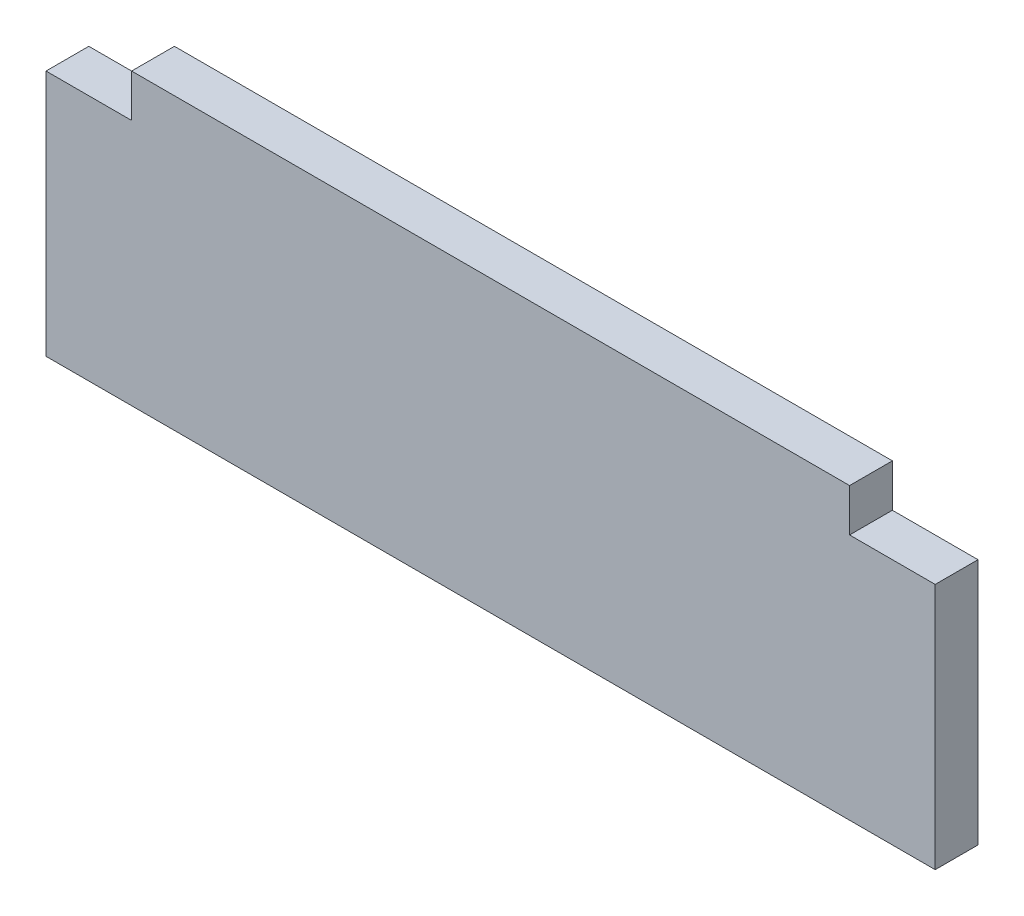
ISO-10303-21;
HEADER;
FILE_DESCRIPTION(('STEP AP214'),'2;1');
FILE_NAME('part.step','',(''),(''),'','','');
FILE_SCHEMA(('AUTOMOTIVE_DESIGN { 1 0 10303 214 1 1 1 1 }'));
ENDSEC;
DATA;
#1=APPLICATION_CONTEXT('core data for automotive mechanical design processes');
#2=APPLICATION_PROTOCOL_DEFINITION('international standard','automotive_design',2000,#1);
#3=PRODUCT_CONTEXT('',#1,'mechanical');
#4=PRODUCT('Part','Part','',(#3));
#5=PRODUCT_RELATED_PRODUCT_CATEGORY('part','',(#4));
#6=PRODUCT_DEFINITION_FORMATION('','',#4);
#7=PRODUCT_DEFINITION_CONTEXT('part definition',#1,'design');
#8=PRODUCT_DEFINITION('design','',#6,#7);
#9=PRODUCT_DEFINITION_SHAPE('','',#8);
#10=(LENGTH_UNIT() NAMED_UNIT(*) SI_UNIT(.MILLI.,.METRE.));
#11=(NAMED_UNIT(*) PLANE_ANGLE_UNIT() SI_UNIT($,.RADIAN.));
#12=(NAMED_UNIT(*) SI_UNIT($,.STERADIAN.) SOLID_ANGLE_UNIT());
#13=UNCERTAINTY_MEASURE_WITH_UNIT(LENGTH_MEASURE(1.E-05),#10,'distance_accuracy_value','');
#14=(GEOMETRIC_REPRESENTATION_CONTEXT(3) GLOBAL_UNCERTAINTY_ASSIGNED_CONTEXT((#13)) GLOBAL_UNIT_ASSIGNED_CONTEXT((#10,
#11,#12)) REPRESENTATION_CONTEXT('',''));
#15=CARTESIAN_POINT('',(0.,0.,0.));
#16=DIRECTION('',(0.,0.,1.));
#17=DIRECTION('',(1.,0.,0.));
#18=AXIS2_PLACEMENT_3D('',#15,#16,#17);
#19=CARTESIAN_POINT('',(65.950000053,21.500000053,3.175));
#20=DIRECTION('',(-1.,0.,0.));
#21=DIRECTION('',(0.,0.,1.));
#22=AXIS2_PLACEMENT_3D('',#19,#20,#21);
#23=PLANE('',#22);
#24=DIRECTION('',(0.,0.,1.));
#25=VECTOR('',#24,1.);
#26=CARTESIAN_POINT('',(65.950000053,15.150000053,-3.175));
#27=LINE('',#26,#25);
#28=CARTESIAN_POINT('',(65.950000053,15.150000053,-3.175));
#29=VERTEX_POINT('',#28);
#30=CARTESIAN_POINT('',(65.950000053,15.150000053,3.175));
#31=VERTEX_POINT('',#30);
#32=EDGE_CURVE('E159',#29,#31,#27,.T.);
#33=ORIENTED_EDGE('',*,*,#32,.T.);
#34=DIRECTION('',(0.,1.,0.));
#35=VECTOR('',#34,1.);
#36=CARTESIAN_POINT('',(65.950000053,21.500000053,3.175));
#37=LINE('',#36,#35);
#38=CARTESIAN_POINT('',(65.950000053,-21.500000053,3.175));
#39=VERTEX_POINT('',#38);
#40=EDGE_CURVE('E132',#39,#31,#37,.T.);
#41=ORIENTED_EDGE('',*,*,#40,.F.);
#42=DIRECTION('',(0.,0.,-1.));
#43=VECTOR('',#42,1.);
#44=CARTESIAN_POINT('',(65.950000053,-21.500000053,3.175));
#45=LINE('',#44,#43);
#46=CARTESIAN_POINT('',(65.950000053,-21.500000053,-3.175));
#47=VERTEX_POINT('',#46);
#48=EDGE_CURVE('E46',#39,#47,#45,.T.);
#49=ORIENTED_EDGE('',*,*,#48,.T.);
#50=DIRECTION('',(0.,1.,0.));
#51=VECTOR('',#50,1.);
#52=CARTESIAN_POINT('',(65.950000053,21.500000053,-3.175));
#53=LINE('',#52,#51);
#54=EDGE_CURVE('E123',#47,#29,#53,.T.);
#55=ORIENTED_EDGE('',*,*,#54,.T.);
#56=EDGE_LOOP('',(#33,#41,#49,#55));
#57=FACE_BOUND('',#56,.T.);
#58=ADVANCED_FACE('F39',(#57),#23,.F.);
#59=CARTESIAN_POINT('',(-65.950000053,21.500000053,3.175));
#60=DIRECTION('',(0.,-1.,0.));
#61=DIRECTION('',(0.,0.,-1.));
#62=AXIS2_PLACEMENT_3D('',#59,#60,#61);
#63=PLANE('',#62);
#64=DIRECTION('',(0.,0.,1.));
#65=VECTOR('',#64,1.);
#66=CARTESIAN_POINT('',(53.250000053,21.500000053,-3.175));
#67=LINE('',#66,#65);
#68=CARTESIAN_POINT('',(53.250000053,21.500000053,-3.175));
#69=VERTEX_POINT('',#68);
#70=CARTESIAN_POINT('',(53.250000053,21.500000053,3.175));
#71=VERTEX_POINT('',#70);
#72=EDGE_CURVE('E105',#69,#71,#67,.T.);
#73=ORIENTED_EDGE('',*,*,#72,.F.);
#74=DIRECTION('',(-1.,0.,0.));
#75=VECTOR('',#74,1.);
#76=CARTESIAN_POINT('',(-65.950000053,21.500000053,-3.175));
#77=LINE('',#76,#75);
#78=CARTESIAN_POINT('',(-53.250000053,21.500000053,-3.175));
#79=VERTEX_POINT('',#78);
#80=EDGE_CURVE('E117',#69,#79,#77,.T.);
#81=ORIENTED_EDGE('',*,*,#80,.T.);
#82=DIRECTION('',(0.,0.,1.));
#83=VECTOR('',#82,1.);
#84=CARTESIAN_POINT('',(-53.250000053,21.500000053,-3.175));
#85=LINE('',#84,#83);
#86=CARTESIAN_POINT('',(-53.250000053,21.500000053,3.175));
#87=VERTEX_POINT('',#86);
#88=EDGE_CURVE('E128',#79,#87,#85,.T.);
#89=ORIENTED_EDGE('',*,*,#88,.T.);
#90=DIRECTION('',(-1.,0.,0.));
#91=VECTOR('',#90,1.);
#92=CARTESIAN_POINT('',(-65.950000053,21.500000053,3.175));
#93=LINE('',#92,#91);
#94=EDGE_CURVE('E118',#71,#87,#93,.T.);
#95=ORIENTED_EDGE('',*,*,#94,.F.);
#96=EDGE_LOOP('',(#73,#81,#89,#95));
#97=FACE_BOUND('',#96,.T.);
#98=ADVANCED_FACE('F115',(#97),#63,.F.);
#99=CARTESIAN_POINT('',(0.,0.,3.175));
#100=DIRECTION('',(0.,0.,1.));
#101=DIRECTION('',(1.,0.,0.));
#102=AXIS2_PLACEMENT_3D('',#99,#100,#101);
#103=PLANE('',#102);
#104=ORIENTED_EDGE('',*,*,#40,.T.);
#105=DIRECTION('',(-1.,0.,0.));
#106=VECTOR('',#105,1.);
#107=CARTESIAN_POINT('',(65.950000053,15.150000053,3.175));
#108=LINE('',#107,#106);
#109=CARTESIAN_POINT('',(53.250000053,15.150000053,3.175));
#110=VERTEX_POINT('',#109);
#111=EDGE_CURVE('E111',#31,#110,#108,.T.);
#112=ORIENTED_EDGE('',*,*,#111,.T.);
#113=DIRECTION('',(0.,1.,0.));
#114=VECTOR('',#113,1.);
#115=CARTESIAN_POINT('',(53.250000053,21.500000053,3.175));
#116=LINE('',#115,#114);
#117=EDGE_CURVE('E167',#110,#71,#116,.T.);
#118=ORIENTED_EDGE('',*,*,#117,.T.);
#119=ORIENTED_EDGE('',*,*,#94,.T.);
#120=DIRECTION('',(0.,1.,0.));
#121=VECTOR('',#120,1.);
#122=CARTESIAN_POINT('',(-53.250000053,21.500000053,3.175));
#123=LINE('',#122,#121);
#124=CARTESIAN_POINT('',(-53.250000053,15.150000053,3.175));
#125=VERTEX_POINT('',#124);
#126=EDGE_CURVE('E152',#125,#87,#123,.T.);
#127=ORIENTED_EDGE('',*,*,#126,.F.);
#128=DIRECTION('',(1.,0.,0.));
#129=VECTOR('',#128,1.);
#130=CARTESIAN_POINT('',(-65.950000053,15.150000053,3.175));
#131=LINE('',#130,#129);
#132=CARTESIAN_POINT('',(-65.950000053,15.150000053,3.175));
#133=VERTEX_POINT('',#132);
#134=EDGE_CURVE('E156',#133,#125,#131,.T.);
#135=ORIENTED_EDGE('',*,*,#134,.F.);
#136=DIRECTION('',(0.,-1.,0.));
#137=VECTOR('',#136,1.);
#138=CARTESIAN_POINT('',(-65.950000053,21.500000053,3.175));
#139=LINE('',#138,#137);
#140=CARTESIAN_POINT('',(-65.950000053,-21.500000053,3.175));
#141=VERTEX_POINT('',#140);
#142=EDGE_CURVE('E139',#133,#141,#139,.T.);
#143=ORIENTED_EDGE('',*,*,#142,.T.);
#144=DIRECTION('',(1.,0.,0.));
#145=VECTOR('',#144,1.);
#146=CARTESIAN_POINT('',(-65.950000053,-21.500000053,3.175));
#147=LINE('',#146,#145);
#148=EDGE_CURVE('E134',#141,#39,#147,.T.);
#149=ORIENTED_EDGE('',*,*,#148,.T.);
#150=EDGE_LOOP('',(#104,#112,#118,#119,#127,#135,#143,#149));
#151=FACE_BOUND('',#150,.T.);
#152=ADVANCED_FACE('F172',(#151),#103,.T.);
#153=CARTESIAN_POINT('',(0.,0.,-3.175));
#154=DIRECTION('',(0.,0.,1.));
#155=DIRECTION('',(1.,0.,0.));
#156=AXIS2_PLACEMENT_3D('',#153,#154,#155);
#157=PLANE('',#156);
#158=DIRECTION('',(-1.,0.,0.));
#159=VECTOR('',#158,1.);
#160=CARTESIAN_POINT('',(65.950000053,15.150000053,-3.175));
#161=LINE('',#160,#159);
#162=CARTESIAN_POINT('',(53.250000053,15.150000053,-3.175));
#163=VERTEX_POINT('',#162);
#164=EDGE_CURVE('E110',#29,#163,#161,.T.);
#165=ORIENTED_EDGE('',*,*,#164,.F.);
#166=ORIENTED_EDGE('',*,*,#54,.F.);
#167=DIRECTION('',(1.,0.,0.));
#168=VECTOR('',#167,1.);
#169=CARTESIAN_POINT('',(-65.950000053,-21.500000053,-3.175));
#170=LINE('',#169,#168);
#171=CARTESIAN_POINT('',(-65.950000053,-21.500000053,-3.175));
#172=VERTEX_POINT('',#171);
#173=EDGE_CURVE('E125',#172,#47,#170,.T.);
#174=ORIENTED_EDGE('',*,*,#173,.F.);
#175=DIRECTION('',(0.,-1.,0.));
#176=VECTOR('',#175,1.);
#177=CARTESIAN_POINT('',(-65.950000053,21.500000053,-3.175));
#178=LINE('',#177,#176);
#179=CARTESIAN_POINT('',(-65.950000053,15.150000053,-3.175));
#180=VERTEX_POINT('',#179);
#181=EDGE_CURVE('E122',#180,#172,#178,.T.);
#182=ORIENTED_EDGE('',*,*,#181,.F.);
#183=DIRECTION('',(1.,0.,0.));
#184=VECTOR('',#183,1.);
#185=CARTESIAN_POINT('',(-65.950000053,15.150000053,-3.175));
#186=LINE('',#185,#184);
#187=CARTESIAN_POINT('',(-53.250000053,15.150000053,-3.175));
#188=VERTEX_POINT('',#187);
#189=EDGE_CURVE('E155',#180,#188,#186,.T.);
#190=ORIENTED_EDGE('',*,*,#189,.T.);
#191=DIRECTION('',(0.,1.,0.));
#192=VECTOR('',#191,1.);
#193=CARTESIAN_POINT('',(-53.250000053,21.500000053,-3.175));
#194=LINE('',#193,#192);
#195=EDGE_CURVE('E61',#188,#79,#194,.T.);
#196=ORIENTED_EDGE('',*,*,#195,.T.);
#197=ORIENTED_EDGE('',*,*,#80,.F.);
#198=DIRECTION('',(0.,1.,0.));
#199=VECTOR('',#198,1.);
#200=CARTESIAN_POINT('',(53.250000053,21.500000053,-3.175));
#201=LINE('',#200,#199);
#202=EDGE_CURVE('E102',#163,#69,#201,.T.);
#203=ORIENTED_EDGE('',*,*,#202,.F.);
#204=EDGE_LOOP('',(#165,#166,#174,#182,#190,#196,#197,#203));
#205=FACE_BOUND('',#204,.T.);
#206=ADVANCED_FACE('F120',(#205),#157,.F.);
#207=CARTESIAN_POINT('',(-65.950000053,21.500000053,3.175));
#208=DIRECTION('',(1.,0.,0.));
#209=DIRECTION('',(0.,0.,-1.));
#210=AXIS2_PLACEMENT_3D('',#207,#208,#209);
#211=PLANE('',#210);
#212=ORIENTED_EDGE('',*,*,#142,.F.);
#213=DIRECTION('',(0.,0.,1.));
#214=VECTOR('',#213,1.);
#215=CARTESIAN_POINT('',(-65.950000053,15.150000053,-3.175));
#216=LINE('',#215,#214);
#217=EDGE_CURVE('E147',#180,#133,#216,.T.);
#218=ORIENTED_EDGE('',*,*,#217,.F.);
#219=ORIENTED_EDGE('',*,*,#181,.T.);
#220=DIRECTION('',(0.,0.,-1.));
#221=VECTOR('',#220,1.);
#222=CARTESIAN_POINT('',(-65.950000053,-21.500000053,3.175));
#223=LINE('',#222,#221);
#224=EDGE_CURVE('E11',#141,#172,#223,.T.);
#225=ORIENTED_EDGE('',*,*,#224,.F.);
#226=EDGE_LOOP('',(#212,#218,#219,#225));
#227=FACE_BOUND('',#226,.T.);
#228=ADVANCED_FACE('F182',(#227),#211,.F.);
#229=CARTESIAN_POINT('',(-65.950000053,-21.500000053,3.175));
#230=DIRECTION('',(0.,1.,0.));
#231=DIRECTION('',(0.,0.,1.));
#232=AXIS2_PLACEMENT_3D('',#229,#230,#231);
#233=PLANE('',#232);
#234=ORIENTED_EDGE('',*,*,#173,.T.);
#235=ORIENTED_EDGE('',*,*,#48,.F.);
#236=ORIENTED_EDGE('',*,*,#148,.F.);
#237=ORIENTED_EDGE('',*,*,#224,.T.);
#238=EDGE_LOOP('',(#234,#235,#236,#237));
#239=FACE_BOUND('',#238,.T.);
#240=ADVANCED_FACE('F185',(#239),#233,.F.);
#241=CARTESIAN_POINT('',(-53.250000053,21.500000053,-3.175));
#242=DIRECTION('',(1.,0.,0.));
#243=DIRECTION('',(0.,0.,-1.));
#244=AXIS2_PLACEMENT_3D('',#241,#242,#243);
#245=PLANE('',#244);
#246=ORIENTED_EDGE('',*,*,#126,.T.);
#247=ORIENTED_EDGE('',*,*,#88,.F.);
#248=ORIENTED_EDGE('',*,*,#195,.F.);
#249=DIRECTION('',(0.,0.,1.));
#250=VECTOR('',#249,1.);
#251=CARTESIAN_POINT('',(-53.250000053,15.150000053,-3.175));
#252=LINE('',#251,#250);
#253=EDGE_CURVE('E149',#188,#125,#252,.T.);
#254=ORIENTED_EDGE('',*,*,#253,.T.);
#255=EDGE_LOOP('',(#246,#247,#248,#254));
#256=FACE_BOUND('',#255,.T.);
#257=ADVANCED_FACE('F175',(#256),#245,.F.);
#258=CARTESIAN_POINT('',(-65.950000053,15.150000053,-3.175));
#259=DIRECTION('',(0.,-1.,0.));
#260=DIRECTION('',(0.,0.,-1.));
#261=AXIS2_PLACEMENT_3D('',#258,#259,#260);
#262=PLANE('',#261);
#263=ORIENTED_EDGE('',*,*,#134,.T.);
#264=ORIENTED_EDGE('',*,*,#253,.F.);
#265=ORIENTED_EDGE('',*,*,#189,.F.);
#266=ORIENTED_EDGE('',*,*,#217,.T.);
#267=EDGE_LOOP('',(#263,#264,#265,#266));
#268=FACE_BOUND('',#267,.T.);
#269=ADVANCED_FACE('F177',(#268),#262,.F.);
#270=CARTESIAN_POINT('',(65.950000053,15.150000053,-3.175));
#271=DIRECTION('',(0.,1.,0.));
#272=DIRECTION('',(0.,0.,1.));
#273=AXIS2_PLACEMENT_3D('',#270,#271,#272);
#274=PLANE('',#273);
#275=ORIENTED_EDGE('',*,*,#111,.F.);
#276=ORIENTED_EDGE('',*,*,#32,.F.);
#277=ORIENTED_EDGE('',*,*,#164,.T.);
#278=DIRECTION('',(0.,0.,1.));
#279=VECTOR('',#278,1.);
#280=CARTESIAN_POINT('',(53.250000053,15.150000053,-3.175));
#281=LINE('',#280,#279);
#282=EDGE_CURVE('E53',#163,#110,#281,.T.);
#283=ORIENTED_EDGE('',*,*,#282,.T.);
#284=EDGE_LOOP('',(#275,#276,#277,#283));
#285=FACE_BOUND('',#284,.T.);
#286=ADVANCED_FACE('F170',(#285),#274,.T.);
#287=CARTESIAN_POINT('',(53.250000053,21.500000053,-3.175));
#288=DIRECTION('',(1.,0.,0.));
#289=DIRECTION('',(0.,0.,-1.));
#290=AXIS2_PLACEMENT_3D('',#287,#288,#289);
#291=PLANE('',#290);
#292=ORIENTED_EDGE('',*,*,#117,.F.);
#293=ORIENTED_EDGE('',*,*,#282,.F.);
#294=ORIENTED_EDGE('',*,*,#202,.T.);
#295=ORIENTED_EDGE('',*,*,#72,.T.);
#296=EDGE_LOOP('',(#292,#293,#294,#295));
#297=FACE_BOUND('',#296,.T.);
#298=ADVANCED_FACE('F104',(#297),#291,.T.);
#299=CLOSED_SHELL('',(#58,#98,#152,#206,#228,#240,#257,#269,#286,#298));
#300=MANIFOLD_SOLID_BREP('B2',#299);
#301=ADVANCED_BREP_SHAPE_REPRESENTATION('',(#18,#300),#14);
#302=SHAPE_DEFINITION_REPRESENTATION(#9,#301);
ENDSEC;
END-ISO-10303-21;
